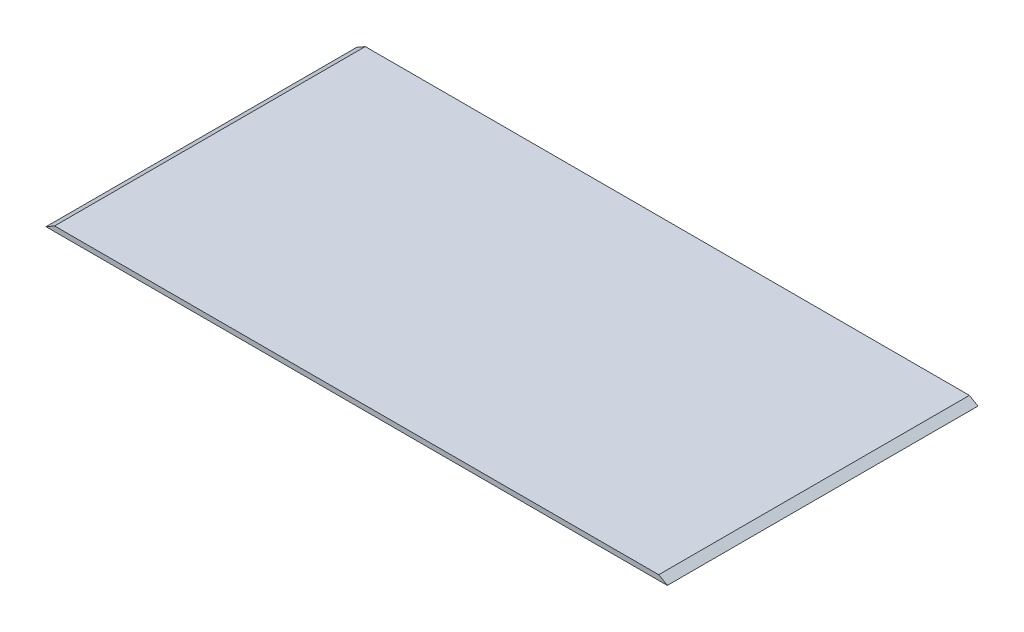
ISO-10303-21;
HEADER;
FILE_DESCRIPTION(('STEP AP214'),'2;1');
FILE_NAME('part.step','',(''),(''),'','','');
FILE_SCHEMA(('AUTOMOTIVE_DESIGN { 1 0 10303 214 1 1 1 1 }'));
ENDSEC;
DATA;
#1=APPLICATION_CONTEXT('core data for automotive mechanical design processes');
#2=APPLICATION_PROTOCOL_DEFINITION('international standard','automotive_design',2000,#1);
#3=PRODUCT_CONTEXT('',#1,'mechanical');
#4=PRODUCT('Part','Part','',(#3));
#5=PRODUCT_RELATED_PRODUCT_CATEGORY('part','',(#4));
#6=PRODUCT_DEFINITION_FORMATION('','',#4);
#7=PRODUCT_DEFINITION_CONTEXT('part definition',#1,'design');
#8=PRODUCT_DEFINITION('design','',#6,#7);
#9=PRODUCT_DEFINITION_SHAPE('','',#8);
#10=(LENGTH_UNIT() NAMED_UNIT(*) SI_UNIT(.MILLI.,.METRE.));
#11=(NAMED_UNIT(*) PLANE_ANGLE_UNIT() SI_UNIT($,.RADIAN.));
#12=(NAMED_UNIT(*) SI_UNIT($,.STERADIAN.) SOLID_ANGLE_UNIT());
#13=UNCERTAINTY_MEASURE_WITH_UNIT(LENGTH_MEASURE(1.E-05),#10,'distance_accuracy_value','');
#14=(GEOMETRIC_REPRESENTATION_CONTEXT(3) GLOBAL_UNCERTAINTY_ASSIGNED_CONTEXT((#13)) GLOBAL_UNIT_ASSIGNED_CONTEXT((#10,
#11,#12)) REPRESENTATION_CONTEXT('',''));
#15=CARTESIAN_POINT('',(0.,0.,0.));
#16=DIRECTION('',(0.,0.,1.));
#17=DIRECTION('',(1.,0.,0.));
#18=AXIS2_PLACEMENT_3D('',#15,#16,#17);
#19=CARTESIAN_POINT('',(0.,0.,0.));
#20=DIRECTION('',(0.,-1.,0.));
#21=DIRECTION('',(0.,0.,-1.));
#22=AXIS2_PLACEMENT_3D('',#19,#20,#21);
#23=PLANE('',#22);
#24=DIRECTION('',(-1.,0.,0.));
#25=VECTOR('',#24,1.);
#26=CARTESIAN_POINT('',(-125.,0.,0.));
#27=LINE('',#26,#25);
#28=CARTESIAN_POINT('',(125.,0.,0.));
#29=VERTEX_POINT('',#28);
#30=CARTESIAN_POINT('',(-125.,0.,0.));
#31=VERTEX_POINT('',#30);
#32=EDGE_CURVE('E183',#29,#31,#27,.T.);
#33=ORIENTED_EDGE('',*,*,#32,.T.);
#34=DIRECTION('',(0.,0.,1.));
#35=VECTOR('',#34,1.);
#36=CARTESIAN_POINT('',(-125.,0.,125.));
#37=LINE('',#36,#35);
#38=CARTESIAN_POINT('',(-125.,0.,-125.));
#39=VERTEX_POINT('',#38);
#40=EDGE_CURVE('E38',#39,#31,#37,.T.);
#41=ORIENTED_EDGE('',*,*,#40,.F.);
#42=DIRECTION('',(-1.,0.,0.));
#43=VECTOR('',#42,1.);
#44=CARTESIAN_POINT('',(-125.,0.,-125.));
#45=LINE('',#44,#43);
#46=CARTESIAN_POINT('',(125.,0.,-125.));
#47=VERTEX_POINT('',#46);
#48=EDGE_CURVE('E193',#47,#39,#45,.T.);
#49=ORIENTED_EDGE('',*,*,#48,.F.);
#50=DIRECTION('',(0.,0.,-1.));
#51=VECTOR('',#50,1.);
#52=CARTESIAN_POINT('',(125.,0.,125.));
#53=LINE('',#52,#51);
#54=EDGE_CURVE('E174',#29,#47,#53,.T.);
#55=ORIENTED_EDGE('',*,*,#54,.F.);
#56=EDGE_LOOP('',(#33,#41,#49,#55));
#57=FACE_BOUND('',#56,.T.);
#58=DIRECTION('',(1.,0.,0.));
#59=VECTOR('',#58,1.);
#60=CARTESIAN_POINT('',(-110.253353701861,0.,-24.7032689142541));
#61=LINE('',#60,#59);
#62=CARTESIAN_POINT('',(-110.253353701861,0.,-24.7032689142541));
#63=VERTEX_POINT('',#62);
#64=CARTESIAN_POINT('',(-100.253353701861,0.,-24.7032689142541));
#65=VERTEX_POINT('',#64);
#66=EDGE_CURVE('E214',#63,#65,#61,.T.);
#67=ORIENTED_EDGE('',*,*,#66,.F.);
#68=DIRECTION('',(0.,0.,-1.));
#69=VECTOR('',#68,1.);
#70=CARTESIAN_POINT('',(-110.253353701861,0.,-14.7032689142541));
#71=LINE('',#70,#69);
#72=CARTESIAN_POINT('',(-110.253353701861,0.,-14.7032689142541));
#73=VERTEX_POINT('',#72);
#74=EDGE_CURVE('E216',#73,#63,#71,.T.);
#75=ORIENTED_EDGE('',*,*,#74,.F.);
#76=DIRECTION('',(-1.,0.,0.));
#77=VECTOR('',#76,1.);
#78=CARTESIAN_POINT('',(-110.253353701861,0.,-14.7032689142541));
#79=LINE('',#78,#77);
#80=CARTESIAN_POINT('',(-100.253353701861,0.,-14.7032689142541));
#81=VERTEX_POINT('',#80);
#82=EDGE_CURVE('E208',#81,#73,#79,.T.);
#83=ORIENTED_EDGE('',*,*,#82,.F.);
#84=DIRECTION('',(0.,0.,1.));
#85=VECTOR('',#84,1.);
#86=CARTESIAN_POINT('',(-100.253353701861,0.,-14.7032689142541));
#87=LINE('',#86,#85);
#88=EDGE_CURVE('E211',#65,#81,#87,.T.);
#89=ORIENTED_EDGE('',*,*,#88,.F.);
#90=EDGE_LOOP('',(#67,#75,#83,#89));
#91=FACE_BOUND('',#90,.T.);
#92=DIRECTION('',(1.,0.,0.));
#93=VECTOR('',#92,1.);
#94=CARTESIAN_POINT('',(-110.253353701861,0.,-109.703268914254));
#95=LINE('',#94,#93);
#96=CARTESIAN_POINT('',(-110.253353701861,0.,-109.703268914254));
#97=VERTEX_POINT('',#96);
#98=CARTESIAN_POINT('',(-100.253353701861,0.,-109.703268914254));
#99=VERTEX_POINT('',#98);
#100=EDGE_CURVE('E243',#97,#99,#95,.T.);
#101=ORIENTED_EDGE('',*,*,#100,.F.);
#102=DIRECTION('',(0.,0.,-1.));
#103=VECTOR('',#102,1.);
#104=CARTESIAN_POINT('',(-110.253353701861,0.,-99.7032689142541));
#105=LINE('',#104,#103);
#106=CARTESIAN_POINT('',(-110.253353701861,0.,-99.7032689142541));
#107=VERTEX_POINT('',#106);
#108=EDGE_CURVE('E245',#107,#97,#105,.T.);
#109=ORIENTED_EDGE('',*,*,#108,.F.);
#110=DIRECTION('',(-1.,0.,0.));
#111=VECTOR('',#110,1.);
#112=CARTESIAN_POINT('',(-110.253353701861,0.,-99.7032689142541));
#113=LINE('',#112,#111);
#114=CARTESIAN_POINT('',(-100.253353701861,0.,-99.7032689142541));
#115=VERTEX_POINT('',#114);
#116=EDGE_CURVE('E237',#115,#107,#113,.T.);
#117=ORIENTED_EDGE('',*,*,#116,.F.);
#118=DIRECTION('',(0.,0.,1.));
#119=VECTOR('',#118,1.);
#120=CARTESIAN_POINT('',(-100.253353701861,0.,-99.7032689142541));
#121=LINE('',#120,#119);
#122=EDGE_CURVE('E240',#99,#115,#121,.T.);
#123=ORIENTED_EDGE('',*,*,#122,.F.);
#124=EDGE_LOOP('',(#101,#109,#117,#123));
#125=FACE_BOUND('',#124,.T.);
#126=DIRECTION('',(1.,0.,0.));
#127=VECTOR('',#126,1.);
#128=CARTESIAN_POINT('',(99.7466462981393,0.,-24.7032689142542));
#129=LINE('',#128,#127);
#130=CARTESIAN_POINT('',(99.7466462981393,0.,-24.7032689142542));
#131=VERTEX_POINT('',#130);
#132=CARTESIAN_POINT('',(109.746646298139,0.,-24.7032689142542));
#133=VERTEX_POINT('',#132);
#134=EDGE_CURVE('E272',#131,#133,#129,.T.);
#135=ORIENTED_EDGE('',*,*,#134,.F.);
#136=DIRECTION('',(0.,0.,-1.));
#137=VECTOR('',#136,1.);
#138=CARTESIAN_POINT('',(99.7466462981393,0.,-14.7032689142542));
#139=LINE('',#138,#137);
#140=CARTESIAN_POINT('',(99.7466462981393,0.,-14.7032689142542));
#141=VERTEX_POINT('',#140);
#142=EDGE_CURVE('E274',#141,#131,#139,.T.);
#143=ORIENTED_EDGE('',*,*,#142,.F.);
#144=DIRECTION('',(-1.,0.,0.));
#145=VECTOR('',#144,1.);
#146=CARTESIAN_POINT('',(99.7466462981393,0.,-14.7032689142542));
#147=LINE('',#146,#145);
#148=CARTESIAN_POINT('',(109.746646298139,0.,-14.7032689142542));
#149=VERTEX_POINT('',#148);
#150=EDGE_CURVE('E266',#149,#141,#147,.T.);
#151=ORIENTED_EDGE('',*,*,#150,.F.);
#152=DIRECTION('',(0.,0.,1.));
#153=VECTOR('',#152,1.);
#154=CARTESIAN_POINT('',(109.746646298139,0.,-14.7032689142542));
#155=LINE('',#154,#153);
#156=EDGE_CURVE('E269',#133,#149,#155,.T.);
#157=ORIENTED_EDGE('',*,*,#156,.F.);
#158=EDGE_LOOP('',(#135,#143,#151,#157));
#159=FACE_BOUND('',#158,.T.);
#160=DIRECTION('',(1.,0.,0.));
#161=VECTOR('',#160,1.);
#162=CARTESIAN_POINT('',(99.7466462981393,0.,-109.703268914254));
#163=LINE('',#162,#161);
#164=CARTESIAN_POINT('',(99.7466462981393,0.,-109.703268914254));
#165=VERTEX_POINT('',#164);
#166=CARTESIAN_POINT('',(109.746646298139,0.,-109.703268914254));
#167=VERTEX_POINT('',#166);
#168=EDGE_CURVE('E299',#165,#167,#163,.T.);
#169=ORIENTED_EDGE('',*,*,#168,.F.);
#170=DIRECTION('',(0.,0.,-1.));
#171=VECTOR('',#170,1.);
#172=CARTESIAN_POINT('',(99.7466462981393,0.,-99.7032689142542));
#173=LINE('',#172,#171);
#174=CARTESIAN_POINT('',(99.7466462981393,0.,-99.7032689142542));
#175=VERTEX_POINT('',#174);
#176=EDGE_CURVE('E301',#175,#165,#173,.T.);
#177=ORIENTED_EDGE('',*,*,#176,.F.);
#178=DIRECTION('',(-1.,0.,0.));
#179=VECTOR('',#178,1.);
#180=CARTESIAN_POINT('',(99.7466462981393,0.,-99.7032689142542));
#181=LINE('',#180,#179);
#182=CARTESIAN_POINT('',(109.746646298139,0.,-99.7032689142542));
#183=VERTEX_POINT('',#182);
#184=EDGE_CURVE('E294',#183,#175,#181,.T.);
#185=ORIENTED_EDGE('',*,*,#184,.F.);
#186=DIRECTION('',(0.,0.,1.));
#187=VECTOR('',#186,1.);
#188=CARTESIAN_POINT('',(109.746646298139,0.,-99.7032689142542));
#189=LINE('',#188,#187);
#190=EDGE_CURVE('E297',#167,#183,#189,.T.);
#191=ORIENTED_EDGE('',*,*,#190,.F.);
#192=EDGE_LOOP('',(#169,#177,#185,#191));
#193=FACE_BOUND('',#192,.T.);
#194=ADVANCED_FACE('F34',(#57,#91,#125,#159,#193),#23,.T.);
#195=CARTESIAN_POINT('',(-125.,2.,-125.));
#196=DIRECTION('',(0.,0.,1.));
#197=DIRECTION('',(1.,0.,0.));
#198=AXIS2_PLACEMENT_3D('',#195,#196,#197);
#199=PLANE('',#198);
#200=DIRECTION('',(-1.,0.,0.));
#201=VECTOR('',#200,1.);
#202=CARTESIAN_POINT('',(-125.,2.,-125.));
#203=LINE('',#202,#201);
#204=CARTESIAN_POINT('',(121.535898384862,2.,-125.));
#205=VERTEX_POINT('',#204);
#206=CARTESIAN_POINT('',(-121.535898384862,2.,-125.));
#207=VERTEX_POINT('',#206);
#208=EDGE_CURVE('E11',#205,#207,#203,.T.);
#209=ORIENTED_EDGE('',*,*,#208,.F.);
#210=DIRECTION('',(-0.866025403784441,0.499999999999995,0.));
#211=VECTOR('',#210,1.);
#212=CARTESIAN_POINT('',(125.,0.,-125.));
#213=LINE('',#212,#211);
#214=EDGE_CURVE('E179',#47,#205,#213,.T.);
#215=ORIENTED_EDGE('',*,*,#214,.F.);
#216=ORIENTED_EDGE('',*,*,#48,.T.);
#217=DIRECTION('',(-0.866025403784441,-0.499999999999995,0.));
#218=VECTOR('',#217,1.);
#219=CARTESIAN_POINT('',(-125.,0.,-125.));
#220=LINE('',#219,#218);
#221=EDGE_CURVE('E313',#207,#39,#220,.T.);
#222=ORIENTED_EDGE('',*,*,#221,.F.);
#223=EDGE_LOOP('',(#209,#215,#216,#222));
#224=FACE_BOUND('',#223,.T.);
#225=ADVANCED_FACE('F36',(#224),#199,.F.);
#226=CARTESIAN_POINT('',(0.,2.,0.));
#227=DIRECTION('',(0.,-1.,0.));
#228=DIRECTION('',(0.,0.,-1.));
#229=AXIS2_PLACEMENT_3D('',#226,#227,#228);
#230=PLANE('',#229);
#231=DIRECTION('',(-1.,0.,0.));
#232=VECTOR('',#231,1.);
#233=CARTESIAN_POINT('',(-125.,2.,0.));
#234=LINE('',#233,#232);
#235=CARTESIAN_POINT('',(121.535898384862,2.00000000000003,0.));
#236=VERTEX_POINT('',#235);
#237=CARTESIAN_POINT('',(-121.535898384862,2.,0.));
#238=VERTEX_POINT('',#237);
#239=EDGE_CURVE('E188',#236,#238,#234,.T.);
#240=ORIENTED_EDGE('',*,*,#239,.F.);
#241=DIRECTION('',(0.,0.,-1.));
#242=VECTOR('',#241,1.);
#243=CARTESIAN_POINT('',(121.535898384862,2.,0.));
#244=LINE('',#243,#242);
#245=EDGE_CURVE('E50',#236,#205,#244,.T.);
#246=ORIENTED_EDGE('',*,*,#245,.T.);
#247=ORIENTED_EDGE('',*,*,#208,.T.);
#248=DIRECTION('',(0.,0.,-1.));
#249=VECTOR('',#248,1.);
#250=CARTESIAN_POINT('',(-121.535898384862,2.,0.));
#251=LINE('',#250,#249);
#252=EDGE_CURVE('E311',#238,#207,#251,.T.);
#253=ORIENTED_EDGE('',*,*,#252,.F.);
#254=EDGE_LOOP('',(#240,#246,#247,#253));
#255=FACE_BOUND('',#254,.T.);
#256=ADVANCED_FACE('F320',(#255),#230,.F.);
#257=CARTESIAN_POINT('',(-125.,-279.508497187474,0.));
#258=DIRECTION('',(0.,0.,-1.));
#259=DIRECTION('',(-1.,0.,0.));
#260=AXIS2_PLACEMENT_3D('',#257,#258,#259);
#261=PLANE('',#260);
#262=ORIENTED_EDGE('',*,*,#32,.F.);
#263=DIRECTION('',(-0.866025403784441,0.499999999999995,0.));
#264=VECTOR('',#263,1.);
#265=CARTESIAN_POINT('',(125.,0.,0.));
#266=LINE('',#265,#264);
#267=EDGE_CURVE('E170',#29,#236,#266,.T.);
#268=ORIENTED_EDGE('',*,*,#267,.T.);
#269=ORIENTED_EDGE('',*,*,#239,.T.);
#270=DIRECTION('',(-0.866025403784441,-0.499999999999995,0.));
#271=VECTOR('',#270,1.);
#272=CARTESIAN_POINT('',(-125.,0.,0.));
#273=LINE('',#272,#271);
#274=EDGE_CURVE('E185',#238,#31,#273,.T.);
#275=ORIENTED_EDGE('',*,*,#274,.T.);
#276=EDGE_LOOP('',(#262,#268,#269,#275));
#277=FACE_BOUND('',#276,.T.);
#278=ADVANCED_FACE('F184',(#277),#261,.F.);
#279=CARTESIAN_POINT('',(-110.253353701861,-10.,-14.7032689142541));
#280=DIRECTION('',(1.,0.,0.));
#281=DIRECTION('',(0.,0.,-1.));
#282=AXIS2_PLACEMENT_3D('',#279,#280,#281);
#283=PLANE('',#282);
#284=ORIENTED_EDGE('',*,*,#74,.T.);
#285=DIRECTION('',(0.,1.,0.));
#286=VECTOR('',#285,1.);
#287=CARTESIAN_POINT('',(-110.253353701861,-10.,-24.7032689142541));
#288=LINE('',#287,#286);
#289=CARTESIAN_POINT('',(-110.253353701861,-10.,-24.7032689142541));
#290=VERTEX_POINT('',#289);
#291=EDGE_CURVE('E197',#290,#63,#288,.T.);
#292=ORIENTED_EDGE('',*,*,#291,.F.);
#293=DIRECTION('',(0.,0.,-1.));
#294=VECTOR('',#293,1.);
#295=CARTESIAN_POINT('',(-110.253353701861,-10.,-14.7032689142541));
#296=LINE('',#295,#294);
#297=CARTESIAN_POINT('',(-110.253353701861,-10.,-14.7032689142541));
#298=VERTEX_POINT('',#297);
#299=EDGE_CURVE('E210',#298,#290,#296,.T.);
#300=ORIENTED_EDGE('',*,*,#299,.F.);
#301=DIRECTION('',(0.,1.,0.));
#302=VECTOR('',#301,1.);
#303=CARTESIAN_POINT('',(-110.253353701861,-10.,-14.7032689142541));
#304=LINE('',#303,#302);
#305=EDGE_CURVE('E204',#298,#73,#304,.T.);
#306=ORIENTED_EDGE('',*,*,#305,.T.);
#307=EDGE_LOOP('',(#284,#292,#300,#306));
#308=FACE_BOUND('',#307,.T.);
#309=ADVANCED_FACE('F346',(#308),#283,.F.);
#310=CARTESIAN_POINT('',(-110.253353701861,-10.,-24.7032689142541));
#311=DIRECTION('',(0.,0.,1.));
#312=DIRECTION('',(1.,0.,0.));
#313=AXIS2_PLACEMENT_3D('',#310,#311,#312);
#314=PLANE('',#313);
#315=ORIENTED_EDGE('',*,*,#66,.T.);
#316=DIRECTION('',(0.,1.,0.));
#317=VECTOR('',#316,1.);
#318=CARTESIAN_POINT('',(-100.253353701861,-10.,-24.7032689142541));
#319=LINE('',#318,#317);
#320=CARTESIAN_POINT('',(-100.253353701861,-10.,-24.7032689142541));
#321=VERTEX_POINT('',#320);
#322=EDGE_CURVE('E199',#321,#65,#319,.T.);
#323=ORIENTED_EDGE('',*,*,#322,.F.);
#324=DIRECTION('',(1.,0.,0.));
#325=VECTOR('',#324,1.);
#326=CARTESIAN_POINT('',(-110.253353701861,-10.,-24.7032689142541));
#327=LINE('',#326,#325);
#328=EDGE_CURVE('E223',#290,#321,#327,.T.);
#329=ORIENTED_EDGE('',*,*,#328,.F.);
#330=ORIENTED_EDGE('',*,*,#291,.T.);
#331=EDGE_LOOP('',(#315,#323,#329,#330));
#332=FACE_BOUND('',#331,.T.);
#333=ADVANCED_FACE('F349',(#332),#314,.F.);
#334=CARTESIAN_POINT('',(-100.253353701861,-10.,-14.7032689142541));
#335=DIRECTION('',(-1.,0.,0.));
#336=DIRECTION('',(0.,0.,1.));
#337=AXIS2_PLACEMENT_3D('',#334,#335,#336);
#338=PLANE('',#337);
#339=ORIENTED_EDGE('',*,*,#88,.T.);
#340=DIRECTION('',(0.,1.,0.));
#341=VECTOR('',#340,1.);
#342=CARTESIAN_POINT('',(-100.253353701861,-10.,-14.7032689142541));
#343=LINE('',#342,#341);
#344=CARTESIAN_POINT('',(-100.253353701861,-10.,-14.7032689142541));
#345=VERTEX_POINT('',#344);
#346=EDGE_CURVE('E202',#345,#81,#343,.T.);
#347=ORIENTED_EDGE('',*,*,#346,.F.);
#348=DIRECTION('',(0.,0.,1.));
#349=VECTOR('',#348,1.);
#350=CARTESIAN_POINT('',(-100.253353701861,-10.,-14.7032689142541));
#351=LINE('',#350,#349);
#352=EDGE_CURVE('E221',#321,#345,#351,.T.);
#353=ORIENTED_EDGE('',*,*,#352,.F.);
#354=ORIENTED_EDGE('',*,*,#322,.T.);
#355=EDGE_LOOP('',(#339,#347,#353,#354));
#356=FACE_BOUND('',#355,.T.);
#357=ADVANCED_FACE('F353',(#356),#338,.F.);
#358=CARTESIAN_POINT('',(-110.253353701861,-10.,-14.7032689142541));
#359=DIRECTION('',(0.,0.,-1.));
#360=DIRECTION('',(-1.,0.,0.));
#361=AXIS2_PLACEMENT_3D('',#358,#359,#360);
#362=PLANE('',#361);
#363=ORIENTED_EDGE('',*,*,#82,.T.);
#364=ORIENTED_EDGE('',*,*,#305,.F.);
#365=DIRECTION('',(-1.,0.,0.));
#366=VECTOR('',#365,1.);
#367=CARTESIAN_POINT('',(-110.253353701861,-10.,-14.7032689142541));
#368=LINE('',#367,#366);
#369=EDGE_CURVE('E207',#345,#298,#368,.T.);
#370=ORIENTED_EDGE('',*,*,#369,.F.);
#371=ORIENTED_EDGE('',*,*,#346,.T.);
#372=EDGE_LOOP('',(#363,#364,#370,#371));
#373=FACE_BOUND('',#372,.T.);
#374=ADVANCED_FACE('F357',(#373),#362,.F.);
#375=CARTESIAN_POINT('',(0.,-10.,0.));
#376=DIRECTION('',(0.,-1.,0.));
#377=DIRECTION('',(0.,0.,-1.));
#378=AXIS2_PLACEMENT_3D('',#375,#376,#377);
#379=PLANE('',#378);
#380=ORIENTED_EDGE('',*,*,#299,.T.);
#381=ORIENTED_EDGE('',*,*,#328,.T.);
#382=ORIENTED_EDGE('',*,*,#352,.T.);
#383=ORIENTED_EDGE('',*,*,#369,.T.);
#384=EDGE_LOOP('',(#380,#381,#382,#383));
#385=FACE_BOUND('',#384,.T.);
#386=ADVANCED_FACE('F361',(#385),#379,.T.);
#387=CARTESIAN_POINT('',(-110.253353701861,-10.,-99.7032689142541));
#388=DIRECTION('',(1.,0.,0.));
#389=DIRECTION('',(0.,0.,-1.));
#390=AXIS2_PLACEMENT_3D('',#387,#388,#389);
#391=PLANE('',#390);
#392=ORIENTED_EDGE('',*,*,#108,.T.);
#393=DIRECTION('',(0.,1.,0.));
#394=VECTOR('',#393,1.);
#395=CARTESIAN_POINT('',(-110.253353701861,-10.,-109.703268914254));
#396=LINE('',#395,#394);
#397=CARTESIAN_POINT('',(-110.253353701861,-10.,-109.703268914254));
#398=VERTEX_POINT('',#397);
#399=EDGE_CURVE('E219',#398,#97,#396,.T.);
#400=ORIENTED_EDGE('',*,*,#399,.F.);
#401=DIRECTION('',(0.,0.,-1.));
#402=VECTOR('',#401,1.);
#403=CARTESIAN_POINT('',(-110.253353701861,-10.,-99.7032689142541));
#404=LINE('',#403,#402);
#405=CARTESIAN_POINT('',(-110.253353701861,-10.,-99.7032689142541));
#406=VERTEX_POINT('',#405);
#407=EDGE_CURVE('E239',#406,#398,#404,.T.);
#408=ORIENTED_EDGE('',*,*,#407,.F.);
#409=DIRECTION('',(0.,1.,0.));
#410=VECTOR('',#409,1.);
#411=CARTESIAN_POINT('',(-110.253353701861,-10.,-99.7032689142541));
#412=LINE('',#411,#410);
#413=EDGE_CURVE('E233',#406,#107,#412,.T.);
#414=ORIENTED_EDGE('',*,*,#413,.T.);
#415=EDGE_LOOP('',(#392,#400,#408,#414));
#416=FACE_BOUND('',#415,.T.);
#417=ADVANCED_FACE('F365',(#416),#391,.F.);
#418=CARTESIAN_POINT('',(-110.253353701861,-10.,-109.703268914254));
#419=DIRECTION('',(0.,0.,1.));
#420=DIRECTION('',(1.,0.,0.));
#421=AXIS2_PLACEMENT_3D('',#418,#419,#420);
#422=PLANE('',#421);
#423=ORIENTED_EDGE('',*,*,#100,.T.);
#424=DIRECTION('',(0.,1.,0.));
#425=VECTOR('',#424,1.);
#426=CARTESIAN_POINT('',(-100.253353701861,-10.,-109.703268914254));
#427=LINE('',#426,#425);
#428=CARTESIAN_POINT('',(-100.253353701861,-10.,-109.703268914254));
#429=VERTEX_POINT('',#428);
#430=EDGE_CURVE('E228',#429,#99,#427,.T.);
#431=ORIENTED_EDGE('',*,*,#430,.F.);
#432=DIRECTION('',(1.,0.,0.));
#433=VECTOR('',#432,1.);
#434=CARTESIAN_POINT('',(-110.253353701861,-10.,-109.703268914254));
#435=LINE('',#434,#433);
#436=EDGE_CURVE('E252',#398,#429,#435,.T.);
#437=ORIENTED_EDGE('',*,*,#436,.F.);
#438=ORIENTED_EDGE('',*,*,#399,.T.);
#439=EDGE_LOOP('',(#423,#431,#437,#438));
#440=FACE_BOUND('',#439,.T.);
#441=ADVANCED_FACE('F369',(#440),#422,.F.);
#442=CARTESIAN_POINT('',(-100.253353701861,-10.,-99.7032689142541));
#443=DIRECTION('',(-1.,0.,0.));
#444=DIRECTION('',(0.,0.,1.));
#445=AXIS2_PLACEMENT_3D('',#442,#443,#444);
#446=PLANE('',#445);
#447=ORIENTED_EDGE('',*,*,#122,.T.);
#448=DIRECTION('',(0.,1.,0.));
#449=VECTOR('',#448,1.);
#450=CARTESIAN_POINT('',(-100.253353701861,-10.,-99.7032689142541));
#451=LINE('',#450,#449);
#452=CARTESIAN_POINT('',(-100.253353701861,-10.,-99.7032689142541));
#453=VERTEX_POINT('',#452);
#454=EDGE_CURVE('E231',#453,#115,#451,.T.);
#455=ORIENTED_EDGE('',*,*,#454,.F.);
#456=DIRECTION('',(0.,0.,1.));
#457=VECTOR('',#456,1.);
#458=CARTESIAN_POINT('',(-100.253353701861,-10.,-99.7032689142541));
#459=LINE('',#458,#457);
#460=EDGE_CURVE('E250',#429,#453,#459,.T.);
#461=ORIENTED_EDGE('',*,*,#460,.F.);
#462=ORIENTED_EDGE('',*,*,#430,.T.);
#463=EDGE_LOOP('',(#447,#455,#461,#462));
#464=FACE_BOUND('',#463,.T.);
#465=ADVANCED_FACE('F373',(#464),#446,.F.);
#466=CARTESIAN_POINT('',(-110.253353701861,-10.,-99.7032689142541));
#467=DIRECTION('',(0.,0.,-1.));
#468=DIRECTION('',(-1.,0.,0.));
#469=AXIS2_PLACEMENT_3D('',#466,#467,#468);
#470=PLANE('',#469);
#471=ORIENTED_EDGE('',*,*,#116,.T.);
#472=ORIENTED_EDGE('',*,*,#413,.F.);
#473=DIRECTION('',(-1.,0.,0.));
#474=VECTOR('',#473,1.);
#475=CARTESIAN_POINT('',(-110.253353701861,-10.,-99.7032689142541));
#476=LINE('',#475,#474);
#477=EDGE_CURVE('E236',#453,#406,#476,.T.);
#478=ORIENTED_EDGE('',*,*,#477,.F.);
#479=ORIENTED_EDGE('',*,*,#454,.T.);
#480=EDGE_LOOP('',(#471,#472,#478,#479));
#481=FACE_BOUND('',#480,.T.);
#482=ADVANCED_FACE('F377',(#481),#470,.F.);
#483=CARTESIAN_POINT('',(0.,-10.,0.));
#484=DIRECTION('',(0.,-1.,0.));
#485=DIRECTION('',(0.,0.,-1.));
#486=AXIS2_PLACEMENT_3D('',#483,#484,#485);
#487=PLANE('',#486);
#488=ORIENTED_EDGE('',*,*,#407,.T.);
#489=ORIENTED_EDGE('',*,*,#436,.T.);
#490=ORIENTED_EDGE('',*,*,#460,.T.);
#491=ORIENTED_EDGE('',*,*,#477,.T.);
#492=EDGE_LOOP('',(#488,#489,#490,#491));
#493=FACE_BOUND('',#492,.T.);
#494=ADVANCED_FACE('F381',(#493),#487,.T.);
#495=CARTESIAN_POINT('',(99.7466462981393,-10.,-14.7032689142542));
#496=DIRECTION('',(1.,0.,0.));
#497=DIRECTION('',(0.,0.,-1.));
#498=AXIS2_PLACEMENT_3D('',#495,#496,#497);
#499=PLANE('',#498);
#500=ORIENTED_EDGE('',*,*,#142,.T.);
#501=DIRECTION('',(0.,1.,0.));
#502=VECTOR('',#501,1.);
#503=CARTESIAN_POINT('',(99.7466462981393,-10.,-24.7032689142542));
#504=LINE('',#503,#502);
#505=CARTESIAN_POINT('',(99.7466462981393,-10.,-24.7032689142542));
#506=VERTEX_POINT('',#505);
#507=EDGE_CURVE('E248',#506,#131,#504,.T.);
#508=ORIENTED_EDGE('',*,*,#507,.F.);
#509=DIRECTION('',(0.,0.,-1.));
#510=VECTOR('',#509,1.);
#511=CARTESIAN_POINT('',(99.7466462981393,-10.,-14.7032689142542));
#512=LINE('',#511,#510);
#513=CARTESIAN_POINT('',(99.7466462981393,-10.,-14.7032689142542));
#514=VERTEX_POINT('',#513);
#515=EDGE_CURVE('E268',#514,#506,#512,.T.);
#516=ORIENTED_EDGE('',*,*,#515,.F.);
#517=DIRECTION('',(0.,1.,0.));
#518=VECTOR('',#517,1.);
#519=CARTESIAN_POINT('',(99.7466462981393,-10.,-14.7032689142542));
#520=LINE('',#519,#518);
#521=EDGE_CURVE('E262',#514,#141,#520,.T.);
#522=ORIENTED_EDGE('',*,*,#521,.T.);
#523=EDGE_LOOP('',(#500,#508,#516,#522));
#524=FACE_BOUND('',#523,.T.);
#525=ADVANCED_FACE('F385',(#524),#499,.F.);
#526=CARTESIAN_POINT('',(99.7466462981393,-10.,-24.7032689142542));
#527=DIRECTION('',(0.,0.,1.));
#528=DIRECTION('',(1.,0.,0.));
#529=AXIS2_PLACEMENT_3D('',#526,#527,#528);
#530=PLANE('',#529);
#531=ORIENTED_EDGE('',*,*,#134,.T.);
#532=DIRECTION('',(0.,1.,0.));
#533=VECTOR('',#532,1.);
#534=CARTESIAN_POINT('',(109.746646298139,-10.,-24.7032689142542));
#535=LINE('',#534,#533);
#536=CARTESIAN_POINT('',(109.746646298139,-10.,-24.7032689142542));
#537=VERTEX_POINT('',#536);
#538=EDGE_CURVE('E257',#537,#133,#535,.T.);
#539=ORIENTED_EDGE('',*,*,#538,.F.);
#540=DIRECTION('',(1.,0.,0.));
#541=VECTOR('',#540,1.);
#542=CARTESIAN_POINT('',(99.7466462981393,-10.,-24.7032689142542));
#543=LINE('',#542,#541);
#544=EDGE_CURVE('E281',#506,#537,#543,.T.);
#545=ORIENTED_EDGE('',*,*,#544,.F.);
#546=ORIENTED_EDGE('',*,*,#507,.T.);
#547=EDGE_LOOP('',(#531,#539,#545,#546));
#548=FACE_BOUND('',#547,.T.);
#549=ADVANCED_FACE('F389',(#548),#530,.F.);
#550=CARTESIAN_POINT('',(109.746646298139,-10.,-14.7032689142542));
#551=DIRECTION('',(-1.,0.,0.));
#552=DIRECTION('',(0.,0.,1.));
#553=AXIS2_PLACEMENT_3D('',#550,#551,#552);
#554=PLANE('',#553);
#555=ORIENTED_EDGE('',*,*,#156,.T.);
#556=DIRECTION('',(0.,1.,0.));
#557=VECTOR('',#556,1.);
#558=CARTESIAN_POINT('',(109.746646298139,-10.,-14.7032689142542));
#559=LINE('',#558,#557);
#560=CARTESIAN_POINT('',(109.746646298139,-10.,-14.7032689142542));
#561=VERTEX_POINT('',#560);
#562=EDGE_CURVE('E260',#561,#149,#559,.T.);
#563=ORIENTED_EDGE('',*,*,#562,.F.);
#564=DIRECTION('',(0.,0.,1.));
#565=VECTOR('',#564,1.);
#566=CARTESIAN_POINT('',(109.746646298139,-10.,-14.7032689142542));
#567=LINE('',#566,#565);
#568=EDGE_CURVE('E279',#537,#561,#567,.T.);
#569=ORIENTED_EDGE('',*,*,#568,.F.);
#570=ORIENTED_EDGE('',*,*,#538,.T.);
#571=EDGE_LOOP('',(#555,#563,#569,#570));
#572=FACE_BOUND('',#571,.T.);
#573=ADVANCED_FACE('F393',(#572),#554,.F.);
#574=CARTESIAN_POINT('',(99.7466462981393,-10.,-14.7032689142542));
#575=DIRECTION('',(0.,0.,-1.));
#576=DIRECTION('',(-1.,0.,0.));
#577=AXIS2_PLACEMENT_3D('',#574,#575,#576);
#578=PLANE('',#577);
#579=ORIENTED_EDGE('',*,*,#150,.T.);
#580=ORIENTED_EDGE('',*,*,#521,.F.);
#581=DIRECTION('',(-1.,0.,0.));
#582=VECTOR('',#581,1.);
#583=CARTESIAN_POINT('',(99.7466462981393,-10.,-14.7032689142542));
#584=LINE('',#583,#582);
#585=EDGE_CURVE('E265',#561,#514,#584,.T.);
#586=ORIENTED_EDGE('',*,*,#585,.F.);
#587=ORIENTED_EDGE('',*,*,#562,.T.);
#588=EDGE_LOOP('',(#579,#580,#586,#587));
#589=FACE_BOUND('',#588,.T.);
#590=ADVANCED_FACE('F397',(#589),#578,.F.);
#591=CARTESIAN_POINT('',(0.,-10.,0.));
#592=DIRECTION('',(0.,-1.,0.));
#593=DIRECTION('',(0.,0.,-1.));
#594=AXIS2_PLACEMENT_3D('',#591,#592,#593);
#595=PLANE('',#594);
#596=ORIENTED_EDGE('',*,*,#515,.T.);
#597=ORIENTED_EDGE('',*,*,#544,.T.);
#598=ORIENTED_EDGE('',*,*,#568,.T.);
#599=ORIENTED_EDGE('',*,*,#585,.T.);
#600=EDGE_LOOP('',(#596,#597,#598,#599));
#601=FACE_BOUND('',#600,.T.);
#602=ADVANCED_FACE('F401',(#601),#595,.T.);
#603=CARTESIAN_POINT('',(99.7466462981393,-10.,-99.7032689142542));
#604=DIRECTION('',(1.,0.,0.));
#605=DIRECTION('',(0.,0.,-1.));
#606=AXIS2_PLACEMENT_3D('',#603,#604,#605);
#607=PLANE('',#606);
#608=ORIENTED_EDGE('',*,*,#176,.T.);
#609=DIRECTION('',(0.,1.,0.));
#610=VECTOR('',#609,1.);
#611=CARTESIAN_POINT('',(99.7466462981393,-10.,-109.703268914254));
#612=LINE('',#611,#610);
#613=CARTESIAN_POINT('',(99.7466462981393,-10.,-109.703268914254));
#614=VERTEX_POINT('',#613);
#615=EDGE_CURVE('E277',#614,#165,#612,.T.);
#616=ORIENTED_EDGE('',*,*,#615,.F.);
#617=DIRECTION('',(0.,0.,-1.));
#618=VECTOR('',#617,1.);
#619=CARTESIAN_POINT('',(99.7466462981393,-10.,-99.7032689142542));
#620=LINE('',#619,#618);
#621=CARTESIAN_POINT('',(99.7466462981393,-10.,-99.7032689142542));
#622=VERTEX_POINT('',#621);
#623=EDGE_CURVE('E296',#622,#614,#620,.T.);
#624=ORIENTED_EDGE('',*,*,#623,.F.);
#625=DIRECTION('',(0.,1.,0.));
#626=VECTOR('',#625,1.);
#627=CARTESIAN_POINT('',(99.7466462981393,-10.,-99.7032689142542));
#628=LINE('',#627,#626);
#629=EDGE_CURVE('E290',#622,#175,#628,.T.);
#630=ORIENTED_EDGE('',*,*,#629,.T.);
#631=EDGE_LOOP('',(#608,#616,#624,#630));
#632=FACE_BOUND('',#631,.T.);
#633=ADVANCED_FACE('F405',(#632),#607,.F.);
#634=CARTESIAN_POINT('',(99.7466462981393,-10.,-109.703268914254));
#635=DIRECTION('',(0.,0.,1.));
#636=DIRECTION('',(1.,0.,0.));
#637=AXIS2_PLACEMENT_3D('',#634,#635,#636);
#638=PLANE('',#637);
#639=ORIENTED_EDGE('',*,*,#168,.T.);
#640=DIRECTION('',(0.,1.,0.));
#641=VECTOR('',#640,1.);
#642=CARTESIAN_POINT('',(109.746646298139,-10.,-109.703268914254));
#643=LINE('',#642,#641);
#644=CARTESIAN_POINT('',(109.746646298139,-10.,-109.703268914254));
#645=VERTEX_POINT('',#644);
#646=EDGE_CURVE('E286',#645,#167,#643,.T.);
#647=ORIENTED_EDGE('',*,*,#646,.F.);
#648=DIRECTION('',(1.,0.,0.));
#649=VECTOR('',#648,1.);
#650=CARTESIAN_POINT('',(99.7466462981393,-10.,-109.703268914254));
#651=LINE('',#650,#649);
#652=EDGE_CURVE('E307',#614,#645,#651,.T.);
#653=ORIENTED_EDGE('',*,*,#652,.F.);
#654=ORIENTED_EDGE('',*,*,#615,.T.);
#655=EDGE_LOOP('',(#639,#647,#653,#654));
#656=FACE_BOUND('',#655,.T.);
#657=ADVANCED_FACE('F409',(#656),#638,.F.);
#658=CARTESIAN_POINT('',(109.746646298139,-10.,-99.7032689142542));
#659=DIRECTION('',(-1.,0.,0.));
#660=DIRECTION('',(0.,0.,1.));
#661=AXIS2_PLACEMENT_3D('',#658,#659,#660);
#662=PLANE('',#661);
#663=ORIENTED_EDGE('',*,*,#190,.T.);
#664=DIRECTION('',(0.,1.,0.));
#665=VECTOR('',#664,1.);
#666=CARTESIAN_POINT('',(109.746646298139,-10.,-99.7032689142542));
#667=LINE('',#666,#665);
#668=CARTESIAN_POINT('',(109.746646298139,-10.,-99.7032689142542));
#669=VERTEX_POINT('',#668);
#670=EDGE_CURVE('E58',#669,#183,#667,.T.);
#671=ORIENTED_EDGE('',*,*,#670,.F.);
#672=DIRECTION('',(0.,0.,1.));
#673=VECTOR('',#672,1.);
#674=CARTESIAN_POINT('',(109.746646298139,-10.,-99.7032689142542));
#675=LINE('',#674,#673);
#676=EDGE_CURVE('E305',#645,#669,#675,.T.);
#677=ORIENTED_EDGE('',*,*,#676,.F.);
#678=ORIENTED_EDGE('',*,*,#646,.T.);
#679=EDGE_LOOP('',(#663,#671,#677,#678));
#680=FACE_BOUND('',#679,.T.);
#681=ADVANCED_FACE('F413',(#680),#662,.F.);
#682=CARTESIAN_POINT('',(99.7466462981393,-10.,-99.7032689142542));
#683=DIRECTION('',(0.,0.,-1.));
#684=DIRECTION('',(-1.,0.,0.));
#685=AXIS2_PLACEMENT_3D('',#682,#683,#684);
#686=PLANE('',#685);
#687=ORIENTED_EDGE('',*,*,#184,.T.);
#688=ORIENTED_EDGE('',*,*,#629,.F.);
#689=DIRECTION('',(-1.,0.,0.));
#690=VECTOR('',#689,1.);
#691=CARTESIAN_POINT('',(99.7466462981393,-10.,-99.7032689142542));
#692=LINE('',#691,#690);
#693=EDGE_CURVE('E293',#669,#622,#692,.T.);
#694=ORIENTED_EDGE('',*,*,#693,.F.);
#695=ORIENTED_EDGE('',*,*,#670,.T.);
#696=EDGE_LOOP('',(#687,#688,#694,#695));
#697=FACE_BOUND('',#696,.T.);
#698=ADVANCED_FACE('F333',(#697),#686,.F.);
#699=CARTESIAN_POINT('',(0.,-10.,0.));
#700=DIRECTION('',(0.,-1.,0.));
#701=DIRECTION('',(0.,0.,-1.));
#702=AXIS2_PLACEMENT_3D('',#699,#700,#701);
#703=PLANE('',#702);
#704=ORIENTED_EDGE('',*,*,#623,.T.);
#705=ORIENTED_EDGE('',*,*,#652,.T.);
#706=ORIENTED_EDGE('',*,*,#676,.T.);
#707=ORIENTED_EDGE('',*,*,#693,.T.);
#708=EDGE_LOOP('',(#704,#705,#706,#707));
#709=FACE_BOUND('',#708,.T.);
#710=ADVANCED_FACE('F326',(#709),#703,.T.);
#711=CARTESIAN_POINT('',(-125.,0.,0.));
#712=DIRECTION('',(0.499999999999995,-0.866025403784441,0.));
#713=DIRECTION('',(0.866025403784441,0.499999999999995,0.));
#714=AXIS2_PLACEMENT_3D('',#711,#712,#713);
#715=PLANE('',#714);
#716=ORIENTED_EDGE('',*,*,#221,.T.);
#717=ORIENTED_EDGE('',*,*,#40,.T.);
#718=ORIENTED_EDGE('',*,*,#274,.F.);
#719=ORIENTED_EDGE('',*,*,#252,.T.);
#720=EDGE_LOOP('',(#716,#717,#718,#719));
#721=FACE_BOUND('',#720,.T.);
#722=ADVANCED_FACE('F324',(#721),#715,.F.);
#723=CARTESIAN_POINT('',(125.,0.,0.));
#724=DIRECTION('',(-0.499999999999995,-0.866025403784441,0.));
#725=DIRECTION('',(0.866025403784441,-0.499999999999995,0.));
#726=AXIS2_PLACEMENT_3D('',#723,#724,#725);
#727=PLANE('',#726);
#728=ORIENTED_EDGE('',*,*,#214,.T.);
#729=ORIENTED_EDGE('',*,*,#245,.F.);
#730=ORIENTED_EDGE('',*,*,#267,.F.);
#731=ORIENTED_EDGE('',*,*,#54,.T.);
#732=EDGE_LOOP('',(#728,#729,#730,#731));
#733=FACE_BOUND('',#732,.T.);
#734=ADVANCED_FACE('F172',(#733),#727,.F.);
#735=CLOSED_SHELL('',(#194,#225,#256,#278,#309,#333,#357,#374,#386,#417,#441,#465,#482,#494,
#525,#549,#573,#590,#602,#633,#657,#681,#698,#710,#722,#734));
#736=MANIFOLD_SOLID_BREP('B2',#735);
#737=ADVANCED_BREP_SHAPE_REPRESENTATION('',(#18,#736),#14);
#738=SHAPE_DEFINITION_REPRESENTATION(#9,#737);
ENDSEC;
END-ISO-10303-21;
